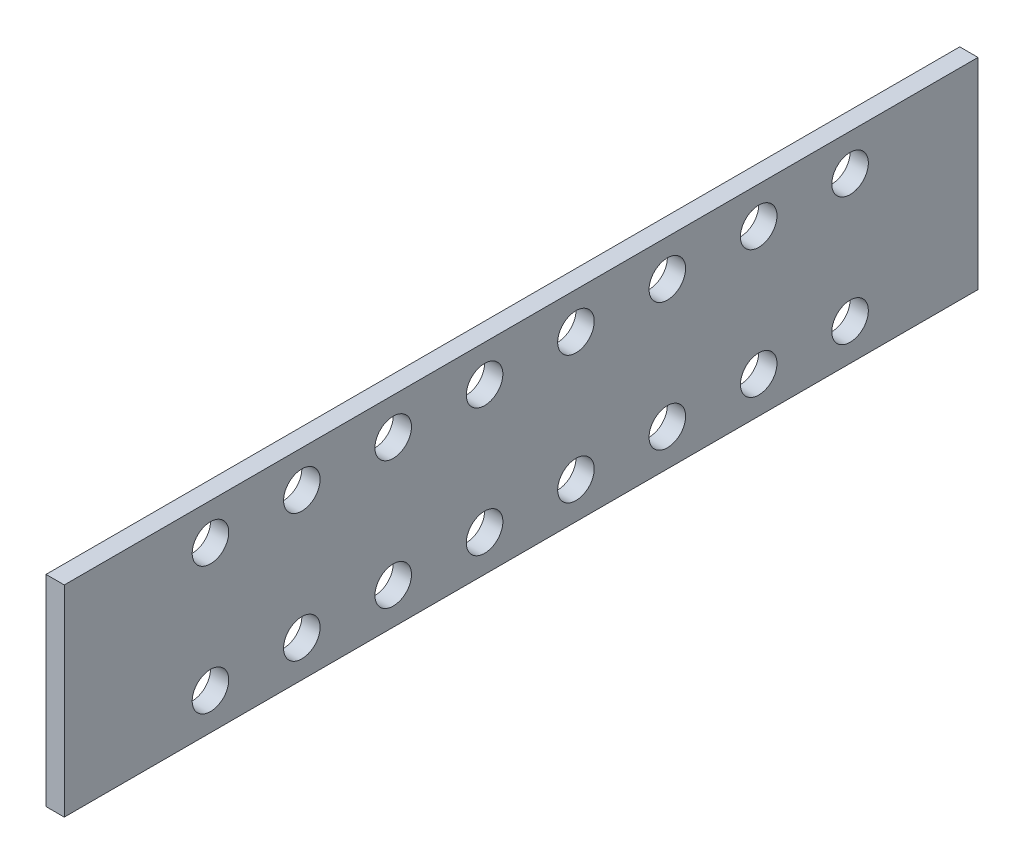
ISO-10303-21;
HEADER;
FILE_DESCRIPTION(('STEP AP214'),'2;1');
FILE_NAME('part.step','',(''),(''),'','','');
FILE_SCHEMA(('AUTOMOTIVE_DESIGN { 1 0 10303 214 1 1 1 1 }'));
ENDSEC;
DATA;
#1=APPLICATION_CONTEXT('core data for automotive mechanical design processes');
#2=APPLICATION_PROTOCOL_DEFINITION('international standard','automotive_design',2000,#1);
#3=PRODUCT_CONTEXT('',#1,'mechanical');
#4=PRODUCT('Part','Part','',(#3));
#5=PRODUCT_RELATED_PRODUCT_CATEGORY('part','',(#4));
#6=PRODUCT_DEFINITION_FORMATION('','',#4);
#7=PRODUCT_DEFINITION_CONTEXT('part definition',#1,'design');
#8=PRODUCT_DEFINITION('design','',#6,#7);
#9=PRODUCT_DEFINITION_SHAPE('','',#8);
#10=(LENGTH_UNIT() NAMED_UNIT(*) SI_UNIT(.MILLI.,.METRE.));
#11=(NAMED_UNIT(*) PLANE_ANGLE_UNIT() SI_UNIT($,.RADIAN.));
#12=(NAMED_UNIT(*) SI_UNIT($,.STERADIAN.) SOLID_ANGLE_UNIT());
#13=UNCERTAINTY_MEASURE_WITH_UNIT(LENGTH_MEASURE(1.E-05),#10,'distance_accuracy_value','');
#14=(GEOMETRIC_REPRESENTATION_CONTEXT(3) GLOBAL_UNCERTAINTY_ASSIGNED_CONTEXT((#13)) GLOBAL_UNIT_ASSIGNED_CONTEXT((#10,
#11,#12)) REPRESENTATION_CONTEXT('',''));
#15=CARTESIAN_POINT('',(0.,0.,0.));
#16=DIRECTION('',(0.,0.,1.));
#17=DIRECTION('',(1.,0.,0.));
#18=AXIS2_PLACEMENT_3D('',#15,#16,#17);
#19=CARTESIAN_POINT('',(0.,110.,-430.));
#20=DIRECTION('',(1.,0.,0.));
#21=DIRECTION('',(0.,0.,-1.));
#22=AXIS2_PLACEMENT_3D('',#19,#20,#21);
#23=CYLINDRICAL_SURFACE('',#22,9.99999999999999);
#24=CARTESIAN_POINT('',(0.,110.,-430.));
#25=DIRECTION('',(1.,0.,0.));
#26=DIRECTION('',(0.,0.,-1.));
#27=AXIS2_PLACEMENT_3D('',#24,#25,#26);
#28=CIRCLE('',#27,9.99999999999999);
#29=CARTESIAN_POINT('',(0.,110.,-440.));
#30=VERTEX_POINT('',#29);
#31=EDGE_CURVE('E52',#30,#30,#28,.T.);
#32=ORIENTED_EDGE('',*,*,#31,.F.);
#33=EDGE_LOOP('',(#32));
#34=FACE_BOUND('',#33,.T.);
#35=CARTESIAN_POINT('',(10.,110.,-430.));
#36=DIRECTION('',(1.,0.,0.));
#37=DIRECTION('',(0.,0.,-1.));
#38=AXIS2_PLACEMENT_3D('',#35,#36,#37);
#39=CIRCLE('',#38,9.99999999999999);
#40=CARTESIAN_POINT('',(10.,110.,-440.));
#41=VERTEX_POINT('',#40);
#42=EDGE_CURVE('E11',#41,#41,#39,.T.);
#43=ORIENTED_EDGE('',*,*,#42,.T.);
#44=EDGE_LOOP('',(#43));
#45=FACE_BOUND('',#44,.T.);
#46=ADVANCED_FACE('F44',(#34,#45),#23,.F.);
#47=CARTESIAN_POINT('',(0.,110.,-380.));
#48=DIRECTION('',(1.,0.,0.));
#49=DIRECTION('',(0.,0.,-1.));
#50=AXIS2_PLACEMENT_3D('',#47,#48,#49);
#51=CYLINDRICAL_SURFACE('',#50,9.99999999999999);
#52=CARTESIAN_POINT('',(0.,110.,-380.));
#53=DIRECTION('',(1.,0.,0.));
#54=DIRECTION('',(0.,0.,-1.));
#55=AXIS2_PLACEMENT_3D('',#52,#53,#54);
#56=CIRCLE('',#55,9.99999999999999);
#57=CARTESIAN_POINT('',(0.,110.,-390.));
#58=VERTEX_POINT('',#57);
#59=EDGE_CURVE('E154',#58,#58,#56,.T.);
#60=ORIENTED_EDGE('',*,*,#59,.F.);
#61=EDGE_LOOP('',(#60));
#62=FACE_BOUND('',#61,.T.);
#63=CARTESIAN_POINT('',(10.,110.,-380.));
#64=DIRECTION('',(1.,0.,0.));
#65=DIRECTION('',(0.,0.,-1.));
#66=AXIS2_PLACEMENT_3D('',#63,#64,#65);
#67=CIRCLE('',#66,9.99999999999999);
#68=CARTESIAN_POINT('',(10.,110.,-390.));
#69=VERTEX_POINT('',#68);
#70=EDGE_CURVE('E158',#69,#69,#67,.T.);
#71=ORIENTED_EDGE('',*,*,#70,.T.);
#72=EDGE_LOOP('',(#71));
#73=FACE_BOUND('',#72,.T.);
#74=ADVANCED_FACE('F169',(#62,#73),#51,.F.);
#75=CARTESIAN_POINT('',(0.,110.,-330.));
#76=DIRECTION('',(1.,0.,0.));
#77=DIRECTION('',(0.,0.,-1.));
#78=AXIS2_PLACEMENT_3D('',#75,#76,#77);
#79=CYLINDRICAL_SURFACE('',#78,9.99999999999999);
#80=CARTESIAN_POINT('',(0.,110.,-330.));
#81=DIRECTION('',(1.,0.,0.));
#82=DIRECTION('',(0.,0.,-1.));
#83=AXIS2_PLACEMENT_3D('',#80,#81,#82);
#84=CIRCLE('',#83,9.99999999999999);
#85=CARTESIAN_POINT('',(0.,110.,-340.));
#86=VERTEX_POINT('',#85);
#87=EDGE_CURVE('E146',#86,#86,#84,.T.);
#88=ORIENTED_EDGE('',*,*,#87,.F.);
#89=EDGE_LOOP('',(#88));
#90=FACE_BOUND('',#89,.T.);
#91=CARTESIAN_POINT('',(10.,110.,-330.));
#92=DIRECTION('',(1.,0.,0.));
#93=DIRECTION('',(0.,0.,-1.));
#94=AXIS2_PLACEMENT_3D('',#91,#92,#93);
#95=CIRCLE('',#94,9.99999999999999);
#96=CARTESIAN_POINT('',(10.,110.,-340.));
#97=VERTEX_POINT('',#96);
#98=EDGE_CURVE('E150',#97,#97,#95,.T.);
#99=ORIENTED_EDGE('',*,*,#98,.T.);
#100=EDGE_LOOP('',(#99));
#101=FACE_BOUND('',#100,.T.);
#102=ADVANCED_FACE('F203',(#90,#101),#79,.F.);
#103=CARTESIAN_POINT('',(0.,110.,-280.));
#104=DIRECTION('',(1.,0.,0.));
#105=DIRECTION('',(0.,0.,-1.));
#106=AXIS2_PLACEMENT_3D('',#103,#104,#105);
#107=CYLINDRICAL_SURFACE('',#106,9.99999999999999);
#108=CARTESIAN_POINT('',(0.,110.,-280.));
#109=DIRECTION('',(1.,0.,0.));
#110=DIRECTION('',(0.,0.,-1.));
#111=AXIS2_PLACEMENT_3D('',#108,#109,#110);
#112=CIRCLE('',#111,9.99999999999999);
#113=CARTESIAN_POINT('',(0.,110.,-290.));
#114=VERTEX_POINT('',#113);
#115=EDGE_CURVE('E138',#114,#114,#112,.T.);
#116=ORIENTED_EDGE('',*,*,#115,.F.);
#117=EDGE_LOOP('',(#116));
#118=FACE_BOUND('',#117,.T.);
#119=CARTESIAN_POINT('',(10.,110.,-280.));
#120=DIRECTION('',(1.,0.,0.));
#121=DIRECTION('',(0.,0.,-1.));
#122=AXIS2_PLACEMENT_3D('',#119,#120,#121);
#123=CIRCLE('',#122,9.99999999999999);
#124=CARTESIAN_POINT('',(10.,110.,-290.));
#125=VERTEX_POINT('',#124);
#126=EDGE_CURVE('E142',#125,#125,#123,.T.);
#127=ORIENTED_EDGE('',*,*,#126,.T.);
#128=EDGE_LOOP('',(#127));
#129=FACE_BOUND('',#128,.T.);
#130=ADVANCED_FACE('F199',(#118,#129),#107,.F.);
#131=CARTESIAN_POINT('',(0.,110.,-230.));
#132=DIRECTION('',(1.,0.,0.));
#133=DIRECTION('',(0.,0.,-1.));
#134=AXIS2_PLACEMENT_3D('',#131,#132,#133);
#135=CYLINDRICAL_SURFACE('',#134,9.99999999999999);
#136=CARTESIAN_POINT('',(0.,110.,-230.));
#137=DIRECTION('',(1.,0.,0.));
#138=DIRECTION('',(0.,0.,-1.));
#139=AXIS2_PLACEMENT_3D('',#136,#137,#138);
#140=CIRCLE('',#139,9.99999999999999);
#141=CARTESIAN_POINT('',(0.,110.,-240.));
#142=VERTEX_POINT('',#141);
#143=EDGE_CURVE('E130',#142,#142,#140,.T.);
#144=ORIENTED_EDGE('',*,*,#143,.F.);
#145=EDGE_LOOP('',(#144));
#146=FACE_BOUND('',#145,.T.);
#147=CARTESIAN_POINT('',(10.,110.,-230.));
#148=DIRECTION('',(1.,0.,0.));
#149=DIRECTION('',(0.,0.,-1.));
#150=AXIS2_PLACEMENT_3D('',#147,#148,#149);
#151=CIRCLE('',#150,9.99999999999999);
#152=CARTESIAN_POINT('',(10.,110.,-240.));
#153=VERTEX_POINT('',#152);
#154=EDGE_CURVE('E134',#153,#153,#151,.T.);
#155=ORIENTED_EDGE('',*,*,#154,.T.);
#156=EDGE_LOOP('',(#155));
#157=FACE_BOUND('',#156,.T.);
#158=ADVANCED_FACE('F195',(#146,#157),#135,.F.);
#159=CARTESIAN_POINT('',(0.,110.,-180.));
#160=DIRECTION('',(1.,0.,0.));
#161=DIRECTION('',(0.,0.,-1.));
#162=AXIS2_PLACEMENT_3D('',#159,#160,#161);
#163=CYLINDRICAL_SURFACE('',#162,9.99999999999999);
#164=CARTESIAN_POINT('',(0.,110.,-180.));
#165=DIRECTION('',(1.,0.,0.));
#166=DIRECTION('',(0.,0.,-1.));
#167=AXIS2_PLACEMENT_3D('',#164,#165,#166);
#168=CIRCLE('',#167,9.99999999999999);
#169=CARTESIAN_POINT('',(0.,110.,-190.));
#170=VERTEX_POINT('',#169);
#171=EDGE_CURVE('E109',#170,#170,#168,.T.);
#172=ORIENTED_EDGE('',*,*,#171,.F.);
#173=EDGE_LOOP('',(#172));
#174=FACE_BOUND('',#173,.T.);
#175=CARTESIAN_POINT('',(10.,110.,-180.));
#176=DIRECTION('',(1.,0.,0.));
#177=DIRECTION('',(0.,0.,-1.));
#178=AXIS2_PLACEMENT_3D('',#175,#176,#177);
#179=CIRCLE('',#178,9.99999999999999);
#180=CARTESIAN_POINT('',(10.,110.,-190.));
#181=VERTEX_POINT('',#180);
#182=EDGE_CURVE('E115',#181,#181,#179,.T.);
#183=ORIENTED_EDGE('',*,*,#182,.T.);
#184=EDGE_LOOP('',(#183));
#185=FACE_BOUND('',#184,.T.);
#186=ADVANCED_FACE('F191',(#174,#185),#163,.F.);
#187=CARTESIAN_POINT('',(10.,0.,0.));
#188=DIRECTION('',(0.,0.,-1.));
#189=DIRECTION('',(-1.,0.,0.));
#190=AXIS2_PLACEMENT_3D('',#187,#188,#189);
#191=PLANE('',#190);
#192=DIRECTION('',(0.,-1.,0.));
#193=VECTOR('',#192,1.);
#194=CARTESIAN_POINT('',(10.,0.,0.));
#195=LINE('',#194,#193);
#196=CARTESIAN_POINT('',(10.,130.010320169078,0.));
#197=VERTEX_POINT('',#196);
#198=CARTESIAN_POINT('',(10.,19.964210349417,0.));
#199=VERTEX_POINT('',#198);
#200=EDGE_CURVE('E110',#197,#199,#195,.T.);
#201=ORIENTED_EDGE('',*,*,#200,.F.);
#202=DIRECTION('',(-1.,0.,0.));
#203=VECTOR('',#202,1.);
#204=CARTESIAN_POINT('',(10.,130.010320169078,0.));
#205=LINE('',#204,#203);
#206=CARTESIAN_POINT('',(0.,130.010320169078,0.));
#207=VERTEX_POINT('',#206);
#208=EDGE_CURVE('E86',#197,#207,#205,.T.);
#209=ORIENTED_EDGE('',*,*,#208,.T.);
#210=DIRECTION('',(0.,-1.,0.));
#211=VECTOR('',#210,1.);
#212=CARTESIAN_POINT('',(0.,0.,0.));
#213=LINE('',#212,#211);
#214=CARTESIAN_POINT('',(0.,19.964210349417,0.));
#215=VERTEX_POINT('',#214);
#216=EDGE_CURVE('E120',#207,#215,#213,.T.);
#217=ORIENTED_EDGE('',*,*,#216,.T.);
#218=DIRECTION('',(-1.,0.,0.));
#219=VECTOR('',#218,1.);
#220=CARTESIAN_POINT('',(10.,19.964210349417,0.));
#221=LINE('',#220,#219);
#222=EDGE_CURVE('E67',#199,#215,#221,.T.);
#223=ORIENTED_EDGE('',*,*,#222,.F.);
#224=EDGE_LOOP('',(#201,#209,#217,#223));
#225=FACE_BOUND('',#224,.T.);
#226=ADVANCED_FACE('F182',(#225),#191,.F.);
#227=CARTESIAN_POINT('',(10.,0.,-500.));
#228=DIRECTION('',(0.,0.,1.));
#229=DIRECTION('',(1.,0.,0.));
#230=AXIS2_PLACEMENT_3D('',#227,#228,#229);
#231=PLANE('',#230);
#232=DIRECTION('',(0.,1.,0.));
#233=VECTOR('',#232,1.);
#234=CARTESIAN_POINT('',(0.,0.,-500.));
#235=LINE('',#234,#233);
#236=CARTESIAN_POINT('',(0.,19.964210349417,-500.));
#237=VERTEX_POINT('',#236);
#238=CARTESIAN_POINT('',(0.,130.010320169078,-500.));
#239=VERTEX_POINT('',#238);
#240=EDGE_CURVE('E101',#237,#239,#235,.T.);
#241=ORIENTED_EDGE('',*,*,#240,.T.);
#242=DIRECTION('',(-1.,0.,0.));
#243=VECTOR('',#242,1.);
#244=CARTESIAN_POINT('',(10.,130.010320169078,-500.));
#245=LINE('',#244,#243);
#246=CARTESIAN_POINT('',(10.,130.010320169078,-500.));
#247=VERTEX_POINT('',#246);
#248=EDGE_CURVE('E59',#247,#239,#245,.T.);
#249=ORIENTED_EDGE('',*,*,#248,.F.);
#250=DIRECTION('',(0.,1.,0.));
#251=VECTOR('',#250,1.);
#252=CARTESIAN_POINT('',(10.,0.,-500.));
#253=LINE('',#252,#251);
#254=CARTESIAN_POINT('',(10.,19.964210349417,-500.));
#255=VERTEX_POINT('',#254);
#256=EDGE_CURVE('E99',#255,#247,#253,.T.);
#257=ORIENTED_EDGE('',*,*,#256,.F.);
#258=DIRECTION('',(-1.,0.,0.));
#259=VECTOR('',#258,1.);
#260=CARTESIAN_POINT('',(10.,19.964210349417,-500.));
#261=LINE('',#260,#259);
#262=EDGE_CURVE('E381',#255,#237,#261,.T.);
#263=ORIENTED_EDGE('',*,*,#262,.T.);
#264=EDGE_LOOP('',(#241,#249,#257,#263));
#265=FACE_BOUND('',#264,.T.);
#266=ADVANCED_FACE('F97',(#265),#231,.F.);
#267=CARTESIAN_POINT('',(10.,0.,0.));
#268=DIRECTION('',(-1.,0.,0.));
#269=DIRECTION('',(0.,0.,1.));
#270=AXIS2_PLACEMENT_3D('',#267,#268,#269);
#271=PLANE('',#270);
#272=CARTESIAN_POINT('',(10.,40.,-130.));
#273=DIRECTION('',(-1.,0.,0.));
#274=DIRECTION('',(0.,0.,-1.));
#275=AXIS2_PLACEMENT_3D('',#272,#273,#274);
#276=CIRCLE('',#275,9.99999999999999);
#277=CARTESIAN_POINT('',(10.,40.,-140.));
#278=VERTEX_POINT('',#277);
#279=EDGE_CURVE('E403',#278,#278,#276,.T.);
#280=ORIENTED_EDGE('',*,*,#279,.T.);
#281=EDGE_LOOP('',(#280));
#282=FACE_BOUND('',#281,.T.);
#283=CARTESIAN_POINT('',(10.,40.,-180.));
#284=DIRECTION('',(-1.,0.,0.));
#285=DIRECTION('',(0.,0.,-1.));
#286=AXIS2_PLACEMENT_3D('',#283,#284,#285);
#287=CIRCLE('',#286,9.99999999999999);
#288=CARTESIAN_POINT('',(10.,40.,-190.));
#289=VERTEX_POINT('',#288);
#290=EDGE_CURVE('E410',#289,#289,#287,.T.);
#291=ORIENTED_EDGE('',*,*,#290,.T.);
#292=EDGE_LOOP('',(#291));
#293=FACE_BOUND('',#292,.T.);
#294=CARTESIAN_POINT('',(10.,40.,-230.));
#295=DIRECTION('',(-1.,0.,0.));
#296=DIRECTION('',(0.,0.,-1.));
#297=AXIS2_PLACEMENT_3D('',#294,#295,#296);
#298=CIRCLE('',#297,9.99999999999999);
#299=CARTESIAN_POINT('',(10.,40.,-240.));
#300=VERTEX_POINT('',#299);
#301=EDGE_CURVE('E418',#300,#300,#298,.T.);
#302=ORIENTED_EDGE('',*,*,#301,.T.);
#303=EDGE_LOOP('',(#302));
#304=FACE_BOUND('',#303,.T.);
#305=CARTESIAN_POINT('',(10.,40.,-280.));
#306=DIRECTION('',(-1.,0.,0.));
#307=DIRECTION('',(0.,0.,-1.));
#308=AXIS2_PLACEMENT_3D('',#305,#306,#307);
#309=CIRCLE('',#308,9.99999999999999);
#310=CARTESIAN_POINT('',(10.,40.,-290.));
#311=VERTEX_POINT('',#310);
#312=EDGE_CURVE('E426',#311,#311,#309,.T.);
#313=ORIENTED_EDGE('',*,*,#312,.T.);
#314=EDGE_LOOP('',(#313));
#315=FACE_BOUND('',#314,.T.);
#316=CARTESIAN_POINT('',(10.,40.,-330.));
#317=DIRECTION('',(-1.,0.,0.));
#318=DIRECTION('',(0.,0.,-1.));
#319=AXIS2_PLACEMENT_3D('',#316,#317,#318);
#320=CIRCLE('',#319,9.99999999999999);
#321=CARTESIAN_POINT('',(10.,40.,-340.));
#322=VERTEX_POINT('',#321);
#323=EDGE_CURVE('E434',#322,#322,#320,.T.);
#324=ORIENTED_EDGE('',*,*,#323,.T.);
#325=EDGE_LOOP('',(#324));
#326=FACE_BOUND('',#325,.T.);
#327=CARTESIAN_POINT('',(10.,40.,-380.));
#328=DIRECTION('',(-1.,0.,0.));
#329=DIRECTION('',(0.,0.,-1.));
#330=AXIS2_PLACEMENT_3D('',#327,#328,#329);
#331=CIRCLE('',#330,9.99999999999999);
#332=CARTESIAN_POINT('',(10.,40.,-390.));
#333=VERTEX_POINT('',#332);
#334=EDGE_CURVE('E442',#333,#333,#331,.T.);
#335=ORIENTED_EDGE('',*,*,#334,.T.);
#336=EDGE_LOOP('',(#335));
#337=FACE_BOUND('',#336,.T.);
#338=CARTESIAN_POINT('',(10.,40.,-430.));
#339=DIRECTION('',(-1.,0.,0.));
#340=DIRECTION('',(0.,0.,-1.));
#341=AXIS2_PLACEMENT_3D('',#338,#339,#340);
#342=CIRCLE('',#341,9.99999999999999);
#343=CARTESIAN_POINT('',(10.,40.,-440.));
#344=VERTEX_POINT('',#343);
#345=EDGE_CURVE('E392',#344,#344,#342,.T.);
#346=ORIENTED_EDGE('',*,*,#345,.T.);
#347=EDGE_LOOP('',(#346));
#348=FACE_BOUND('',#347,.T.);
#349=CARTESIAN_POINT('',(10.,40.,-80.));
#350=DIRECTION('',(-1.,0.,0.));
#351=DIRECTION('',(0.,0.,-1.));
#352=AXIS2_PLACEMENT_3D('',#349,#350,#351);
#353=CIRCLE('',#352,9.99999999999999);
#354=CARTESIAN_POINT('',(10.,40.,-90.));
#355=VERTEX_POINT('',#354);
#356=EDGE_CURVE('E402',#355,#355,#353,.T.);
#357=ORIENTED_EDGE('',*,*,#356,.T.);
#358=EDGE_LOOP('',(#357));
#359=FACE_BOUND('',#358,.T.);
#360=CARTESIAN_POINT('',(10.,110.,-130.));
#361=DIRECTION('',(1.,0.,0.));
#362=DIRECTION('',(0.,0.,-1.));
#363=AXIS2_PLACEMENT_3D('',#360,#361,#362);
#364=CIRCLE('',#363,9.99999999999999);
#365=CARTESIAN_POINT('',(10.,110.,-140.));
#366=VERTEX_POINT('',#365);
#367=EDGE_CURVE('E464',#366,#366,#364,.T.);
#368=ORIENTED_EDGE('',*,*,#367,.F.);
#369=EDGE_LOOP('',(#368));
#370=FACE_BOUND('',#369,.T.);
#371=CARTESIAN_POINT('',(10.,110.,-80.));
#372=DIRECTION('',(1.,0.,0.));
#373=DIRECTION('',(0.,0.,-1.));
#374=AXIS2_PLACEMENT_3D('',#371,#372,#373);
#375=CIRCLE('',#374,9.99999999999999);
#376=CARTESIAN_POINT('',(10.,110.,-90.));
#377=VERTEX_POINT('',#376);
#378=EDGE_CURVE('E468',#377,#377,#375,.T.);
#379=ORIENTED_EDGE('',*,*,#378,.F.);
#380=EDGE_LOOP('',(#379));
#381=FACE_BOUND('',#380,.T.);
#382=ORIENTED_EDGE('',*,*,#256,.T.);
#383=DIRECTION('',(0.,0.,1.));
#384=VECTOR('',#383,1.);
#385=CARTESIAN_POINT('',(10.,130.010320169078,-500.));
#386=LINE('',#385,#384);
#387=EDGE_CURVE('E83',#247,#197,#386,.T.);
#388=ORIENTED_EDGE('',*,*,#387,.T.);
#389=ORIENTED_EDGE('',*,*,#200,.T.);
#390=DIRECTION('',(0.,0.,-1.));
#391=VECTOR('',#390,1.);
#392=CARTESIAN_POINT('',(10.,19.964210349417,-500.));
#393=LINE('',#392,#391);
#394=EDGE_CURVE('E107',#199,#255,#393,.T.);
#395=ORIENTED_EDGE('',*,*,#394,.T.);
#396=EDGE_LOOP('',(#382,#388,#389,#395));
#397=FACE_BOUND('',#396,.T.);
#398=ORIENTED_EDGE('',*,*,#182,.F.);
#399=EDGE_LOOP('',(#398));
#400=FACE_BOUND('',#399,.T.);
#401=ORIENTED_EDGE('',*,*,#154,.F.);
#402=EDGE_LOOP('',(#401));
#403=FACE_BOUND('',#402,.T.);
#404=ORIENTED_EDGE('',*,*,#126,.F.);
#405=EDGE_LOOP('',(#404));
#406=FACE_BOUND('',#405,.T.);
#407=ORIENTED_EDGE('',*,*,#98,.F.);
#408=EDGE_LOOP('',(#407));
#409=FACE_BOUND('',#408,.T.);
#410=ORIENTED_EDGE('',*,*,#70,.F.);
#411=EDGE_LOOP('',(#410));
#412=FACE_BOUND('',#411,.T.);
#413=ORIENTED_EDGE('',*,*,#42,.F.);
#414=EDGE_LOOP('',(#413));
#415=FACE_BOUND('',#414,.T.);
#416=ADVANCED_FACE('F105',(#282,#293,#304,#315,#326,#337,#348,#359,#370,#381,#397,#400,#403,
#406,#409,#412,#415),#271,.F.);
#417=CARTESIAN_POINT('',(0.,0.,0.));
#418=DIRECTION('',(-1.,0.,0.));
#419=DIRECTION('',(0.,0.,1.));
#420=AXIS2_PLACEMENT_3D('',#417,#418,#419);
#421=PLANE('',#420);
#422=DIRECTION('',(0.,0.,1.));
#423=VECTOR('',#422,1.);
#424=CARTESIAN_POINT('',(0.,130.010320169078,-500.));
#425=LINE('',#424,#423);
#426=EDGE_CURVE('E92',#239,#207,#425,.T.);
#427=ORIENTED_EDGE('',*,*,#426,.F.);
#428=ORIENTED_EDGE('',*,*,#240,.F.);
#429=DIRECTION('',(0.,0.,-1.));
#430=VECTOR('',#429,1.);
#431=CARTESIAN_POINT('',(0.,19.964210349417,-500.));
#432=LINE('',#431,#430);
#433=EDGE_CURVE('E380',#215,#237,#432,.T.);
#434=ORIENTED_EDGE('',*,*,#433,.F.);
#435=ORIENTED_EDGE('',*,*,#216,.F.);
#436=EDGE_LOOP('',(#427,#428,#434,#435));
#437=FACE_BOUND('',#436,.T.);
#438=CARTESIAN_POINT('',(0.,40.,-130.));
#439=DIRECTION('',(-1.,0.,0.));
#440=DIRECTION('',(0.,0.,-1.));
#441=AXIS2_PLACEMENT_3D('',#438,#439,#440);
#442=CIRCLE('',#441,9.99999999999999);
#443=CARTESIAN_POINT('',(0.,40.,-140.));
#444=VERTEX_POINT('',#443);
#445=EDGE_CURVE('E398',#444,#444,#442,.T.);
#446=ORIENTED_EDGE('',*,*,#445,.F.);
#447=EDGE_LOOP('',(#446));
#448=FACE_BOUND('',#447,.T.);
#449=CARTESIAN_POINT('',(0.,40.,-180.));
#450=DIRECTION('',(-1.,0.,0.));
#451=DIRECTION('',(0.,0.,-1.));
#452=AXIS2_PLACEMENT_3D('',#449,#450,#451);
#453=CIRCLE('',#452,9.99999999999999);
#454=CARTESIAN_POINT('',(0.,40.,-190.));
#455=VERTEX_POINT('',#454);
#456=EDGE_CURVE('E406',#455,#455,#453,.T.);
#457=ORIENTED_EDGE('',*,*,#456,.F.);
#458=EDGE_LOOP('',(#457));
#459=FACE_BOUND('',#458,.T.);
#460=CARTESIAN_POINT('',(0.,40.,-230.));
#461=DIRECTION('',(-1.,0.,0.));
#462=DIRECTION('',(0.,0.,-1.));
#463=AXIS2_PLACEMENT_3D('',#460,#461,#462);
#464=CIRCLE('',#463,9.99999999999999);
#465=CARTESIAN_POINT('',(0.,40.,-240.));
#466=VERTEX_POINT('',#465);
#467=EDGE_CURVE('E414',#466,#466,#464,.T.);
#468=ORIENTED_EDGE('',*,*,#467,.F.);
#469=EDGE_LOOP('',(#468));
#470=FACE_BOUND('',#469,.T.);
#471=CARTESIAN_POINT('',(0.,40.,-280.));
#472=DIRECTION('',(-1.,0.,0.));
#473=DIRECTION('',(0.,0.,-1.));
#474=AXIS2_PLACEMENT_3D('',#471,#472,#473);
#475=CIRCLE('',#474,9.99999999999999);
#476=CARTESIAN_POINT('',(0.,40.,-290.));
#477=VERTEX_POINT('',#476);
#478=EDGE_CURVE('E422',#477,#477,#475,.T.);
#479=ORIENTED_EDGE('',*,*,#478,.F.);
#480=EDGE_LOOP('',(#479));
#481=FACE_BOUND('',#480,.T.);
#482=CARTESIAN_POINT('',(0.,40.,-330.));
#483=DIRECTION('',(-1.,0.,0.));
#484=DIRECTION('',(0.,0.,-1.));
#485=AXIS2_PLACEMENT_3D('',#482,#483,#484);
#486=CIRCLE('',#485,9.99999999999999);
#487=CARTESIAN_POINT('',(0.,40.,-340.));
#488=VERTEX_POINT('',#487);
#489=EDGE_CURVE('E430',#488,#488,#486,.T.);
#490=ORIENTED_EDGE('',*,*,#489,.F.);
#491=EDGE_LOOP('',(#490));
#492=FACE_BOUND('',#491,.T.);
#493=CARTESIAN_POINT('',(0.,40.,-380.));
#494=DIRECTION('',(-1.,0.,0.));
#495=DIRECTION('',(0.,0.,-1.));
#496=AXIS2_PLACEMENT_3D('',#493,#494,#495);
#497=CIRCLE('',#496,9.99999999999999);
#498=CARTESIAN_POINT('',(0.,40.,-390.));
#499=VERTEX_POINT('',#498);
#500=EDGE_CURVE('E438',#499,#499,#497,.T.);
#501=ORIENTED_EDGE('',*,*,#500,.F.);
#502=EDGE_LOOP('',(#501));
#503=FACE_BOUND('',#502,.T.);
#504=CARTESIAN_POINT('',(0.,40.,-430.));
#505=DIRECTION('',(-1.,0.,0.));
#506=DIRECTION('',(0.,0.,-1.));
#507=AXIS2_PLACEMENT_3D('',#504,#505,#506);
#508=CIRCLE('',#507,9.99999999999999);
#509=CARTESIAN_POINT('',(0.,40.,-440.));
#510=VERTEX_POINT('',#509);
#511=EDGE_CURVE('E446',#510,#510,#508,.T.);
#512=ORIENTED_EDGE('',*,*,#511,.F.);
#513=EDGE_LOOP('',(#512));
#514=FACE_BOUND('',#513,.T.);
#515=CARTESIAN_POINT('',(0.,40.,-80.));
#516=DIRECTION('',(-1.,0.,0.));
#517=DIRECTION('',(0.,0.,-1.));
#518=AXIS2_PLACEMENT_3D('',#515,#516,#517);
#519=CIRCLE('',#518,9.99999999999999);
#520=CARTESIAN_POINT('',(0.,40.,-90.));
#521=VERTEX_POINT('',#520);
#522=EDGE_CURVE('E453',#521,#521,#519,.T.);
#523=ORIENTED_EDGE('',*,*,#522,.F.);
#524=EDGE_LOOP('',(#523));
#525=FACE_BOUND('',#524,.T.);
#526=CARTESIAN_POINT('',(0.,110.,-130.));
#527=DIRECTION('',(1.,0.,0.));
#528=DIRECTION('',(0.,0.,-1.));
#529=AXIS2_PLACEMENT_3D('',#526,#527,#528);
#530=CIRCLE('',#529,9.99999999999999);
#531=CARTESIAN_POINT('',(0.,110.,-140.));
#532=VERTEX_POINT('',#531);
#533=EDGE_CURVE('E457',#532,#532,#530,.T.);
#534=ORIENTED_EDGE('',*,*,#533,.T.);
#535=EDGE_LOOP('',(#534));
#536=FACE_BOUND('',#535,.T.);
#537=CARTESIAN_POINT('',(0.,110.,-80.));
#538=DIRECTION('',(1.,0.,0.));
#539=DIRECTION('',(0.,0.,-1.));
#540=AXIS2_PLACEMENT_3D('',#537,#538,#539);
#541=CIRCLE('',#540,9.99999999999999);
#542=CARTESIAN_POINT('',(0.,110.,-90.));
#543=VERTEX_POINT('',#542);
#544=EDGE_CURVE('E124',#543,#543,#541,.T.);
#545=ORIENTED_EDGE('',*,*,#544,.T.);
#546=EDGE_LOOP('',(#545));
#547=FACE_BOUND('',#546,.T.);
#548=ORIENTED_EDGE('',*,*,#171,.T.);
#549=EDGE_LOOP('',(#548));
#550=FACE_BOUND('',#549,.T.);
#551=ORIENTED_EDGE('',*,*,#143,.T.);
#552=EDGE_LOOP('',(#551));
#553=FACE_BOUND('',#552,.T.);
#554=ORIENTED_EDGE('',*,*,#115,.T.);
#555=EDGE_LOOP('',(#554));
#556=FACE_BOUND('',#555,.T.);
#557=ORIENTED_EDGE('',*,*,#87,.T.);
#558=EDGE_LOOP('',(#557));
#559=FACE_BOUND('',#558,.T.);
#560=ORIENTED_EDGE('',*,*,#59,.T.);
#561=EDGE_LOOP('',(#560));
#562=FACE_BOUND('',#561,.T.);
#563=ORIENTED_EDGE('',*,*,#31,.T.);
#564=EDGE_LOOP('',(#563));
#565=FACE_BOUND('',#564,.T.);
#566=ADVANCED_FACE('F165',(#437,#448,#459,#470,#481,#492,#503,#514,#525,#536,#547,#550,#553,
#556,#559,#562,#565),#421,.T.);
#567=CARTESIAN_POINT('',(0.,110.,-80.));
#568=DIRECTION('',(1.,0.,0.));
#569=DIRECTION('',(0.,0.,-1.));
#570=AXIS2_PLACEMENT_3D('',#567,#568,#569);
#571=CYLINDRICAL_SURFACE('',#570,9.99999999999999);
#572=ORIENTED_EDGE('',*,*,#544,.F.);
#573=EDGE_LOOP('',(#572));
#574=FACE_BOUND('',#573,.T.);
#575=ORIENTED_EDGE('',*,*,#378,.T.);
#576=EDGE_LOOP('',(#575));
#577=FACE_BOUND('',#576,.T.);
#578=ADVANCED_FACE('F179',(#574,#577),#571,.F.);
#579=CARTESIAN_POINT('',(0.,110.,-130.));
#580=DIRECTION('',(1.,0.,0.));
#581=DIRECTION('',(0.,0.,-1.));
#582=AXIS2_PLACEMENT_3D('',#579,#580,#581);
#583=CYLINDRICAL_SURFACE('',#582,9.99999999999999);
#584=ORIENTED_EDGE('',*,*,#533,.F.);
#585=EDGE_LOOP('',(#584));
#586=FACE_BOUND('',#585,.T.);
#587=ORIENTED_EDGE('',*,*,#367,.T.);
#588=EDGE_LOOP('',(#587));
#589=FACE_BOUND('',#588,.T.);
#590=ADVANCED_FACE('F244',(#586,#589),#583,.F.);
#591=CARTESIAN_POINT('',(0.,40.,-80.));
#592=DIRECTION('',(1.,0.,0.));
#593=DIRECTION('',(0.,0.,-1.));
#594=AXIS2_PLACEMENT_3D('',#591,#592,#593);
#595=CYLINDRICAL_SURFACE('',#594,9.99999999999999);
#596=ORIENTED_EDGE('',*,*,#522,.T.);
#597=EDGE_LOOP('',(#596));
#598=FACE_BOUND('',#597,.T.);
#599=ORIENTED_EDGE('',*,*,#356,.F.);
#600=EDGE_LOOP('',(#599));
#601=FACE_BOUND('',#600,.T.);
#602=ADVANCED_FACE('F247',(#598,#601),#595,.F.);
#603=CARTESIAN_POINT('',(0.,40.,-430.));
#604=DIRECTION('',(1.,0.,0.));
#605=DIRECTION('',(0.,0.,-1.));
#606=AXIS2_PLACEMENT_3D('',#603,#604,#605);
#607=CYLINDRICAL_SURFACE('',#606,9.99999999999999);
#608=ORIENTED_EDGE('',*,*,#511,.T.);
#609=EDGE_LOOP('',(#608));
#610=FACE_BOUND('',#609,.T.);
#611=ORIENTED_EDGE('',*,*,#345,.F.);
#612=EDGE_LOOP('',(#611));
#613=FACE_BOUND('',#612,.T.);
#614=ADVANCED_FACE('F255',(#610,#613),#607,.F.);
#615=CARTESIAN_POINT('',(0.,40.,-380.));
#616=DIRECTION('',(1.,0.,0.));
#617=DIRECTION('',(0.,0.,-1.));
#618=AXIS2_PLACEMENT_3D('',#615,#616,#617);
#619=CYLINDRICAL_SURFACE('',#618,9.99999999999999);
#620=ORIENTED_EDGE('',*,*,#500,.T.);
#621=EDGE_LOOP('',(#620));
#622=FACE_BOUND('',#621,.T.);
#623=ORIENTED_EDGE('',*,*,#334,.F.);
#624=EDGE_LOOP('',(#623));
#625=FACE_BOUND('',#624,.T.);
#626=ADVANCED_FACE('F264',(#622,#625),#619,.F.);
#627=CARTESIAN_POINT('',(0.,40.,-330.));
#628=DIRECTION('',(1.,0.,0.));
#629=DIRECTION('',(0.,0.,-1.));
#630=AXIS2_PLACEMENT_3D('',#627,#628,#629);
#631=CYLINDRICAL_SURFACE('',#630,9.99999999999999);
#632=ORIENTED_EDGE('',*,*,#489,.T.);
#633=EDGE_LOOP('',(#632));
#634=FACE_BOUND('',#633,.T.);
#635=ORIENTED_EDGE('',*,*,#323,.F.);
#636=EDGE_LOOP('',(#635));
#637=FACE_BOUND('',#636,.T.);
#638=ADVANCED_FACE('F273',(#634,#637),#631,.F.);
#639=CARTESIAN_POINT('',(0.,40.,-280.));
#640=DIRECTION('',(1.,0.,0.));
#641=DIRECTION('',(0.,0.,-1.));
#642=AXIS2_PLACEMENT_3D('',#639,#640,#641);
#643=CYLINDRICAL_SURFACE('',#642,9.99999999999999);
#644=ORIENTED_EDGE('',*,*,#478,.T.);
#645=EDGE_LOOP('',(#644));
#646=FACE_BOUND('',#645,.T.);
#647=ORIENTED_EDGE('',*,*,#312,.F.);
#648=EDGE_LOOP('',(#647));
#649=FACE_BOUND('',#648,.T.);
#650=ADVANCED_FACE('F282',(#646,#649),#643,.F.);
#651=CARTESIAN_POINT('',(0.,40.,-230.));
#652=DIRECTION('',(1.,0.,0.));
#653=DIRECTION('',(0.,0.,-1.));
#654=AXIS2_PLACEMENT_3D('',#651,#652,#653);
#655=CYLINDRICAL_SURFACE('',#654,9.99999999999999);
#656=ORIENTED_EDGE('',*,*,#467,.T.);
#657=EDGE_LOOP('',(#656));
#658=FACE_BOUND('',#657,.T.);
#659=ORIENTED_EDGE('',*,*,#301,.F.);
#660=EDGE_LOOP('',(#659));
#661=FACE_BOUND('',#660,.T.);
#662=ADVANCED_FACE('F291',(#658,#661),#655,.F.);
#663=CARTESIAN_POINT('',(0.,40.,-180.));
#664=DIRECTION('',(1.,0.,0.));
#665=DIRECTION('',(0.,0.,-1.));
#666=AXIS2_PLACEMENT_3D('',#663,#664,#665);
#667=CYLINDRICAL_SURFACE('',#666,9.99999999999999);
#668=ORIENTED_EDGE('',*,*,#456,.T.);
#669=EDGE_LOOP('',(#668));
#670=FACE_BOUND('',#669,.T.);
#671=ORIENTED_EDGE('',*,*,#290,.F.);
#672=EDGE_LOOP('',(#671));
#673=FACE_BOUND('',#672,.T.);
#674=ADVANCED_FACE('F300',(#670,#673),#667,.F.);
#675=CARTESIAN_POINT('',(0.,40.,-130.));
#676=DIRECTION('',(1.,0.,0.));
#677=DIRECTION('',(0.,0.,-1.));
#678=AXIS2_PLACEMENT_3D('',#675,#676,#677);
#679=CYLINDRICAL_SURFACE('',#678,9.99999999999999);
#680=ORIENTED_EDGE('',*,*,#445,.T.);
#681=EDGE_LOOP('',(#680));
#682=FACE_BOUND('',#681,.T.);
#683=ORIENTED_EDGE('',*,*,#279,.F.);
#684=EDGE_LOOP('',(#683));
#685=FACE_BOUND('',#684,.T.);
#686=ADVANCED_FACE('F309',(#682,#685),#679,.F.);
#687=CARTESIAN_POINT('',(10.,19.964210349417,-500.));
#688=DIRECTION('',(0.,1.,0.));
#689=DIRECTION('',(0.,0.,1.));
#690=AXIS2_PLACEMENT_3D('',#687,#688,#689);
#691=PLANE('',#690);
#692=ORIENTED_EDGE('',*,*,#433,.T.);
#693=ORIENTED_EDGE('',*,*,#262,.F.);
#694=ORIENTED_EDGE('',*,*,#394,.F.);
#695=ORIENTED_EDGE('',*,*,#222,.T.);
#696=EDGE_LOOP('',(#692,#693,#694,#695));
#697=FACE_BOUND('',#696,.T.);
#698=ADVANCED_FACE('F317',(#697),#691,.F.);
#699=CARTESIAN_POINT('',(10.,130.010320169078,-500.));
#700=DIRECTION('',(0.,-1.,0.));
#701=DIRECTION('',(0.,0.,-1.));
#702=AXIS2_PLACEMENT_3D('',#699,#700,#701);
#703=PLANE('',#702);
#704=ORIENTED_EDGE('',*,*,#426,.T.);
#705=ORIENTED_EDGE('',*,*,#208,.F.);
#706=ORIENTED_EDGE('',*,*,#387,.F.);
#707=ORIENTED_EDGE('',*,*,#248,.T.);
#708=EDGE_LOOP('',(#704,#705,#706,#707));
#709=FACE_BOUND('',#708,.T.);
#710=ADVANCED_FACE('F84',(#709),#703,.F.);
#711=CLOSED_SHELL('',(#46,#74,#102,#130,#158,#186,#226,#266,#416,#566,#578,#590,#602,#614,#626,
#638,#650,#662,#674,#686,#698,#710));
#712=MANIFOLD_SOLID_BREP('B2',#711);
#713=ADVANCED_BREP_SHAPE_REPRESENTATION('',(#18,#712),#14);
#714=SHAPE_DEFINITION_REPRESENTATION(#9,#713);
ENDSEC;
END-ISO-10303-21;
